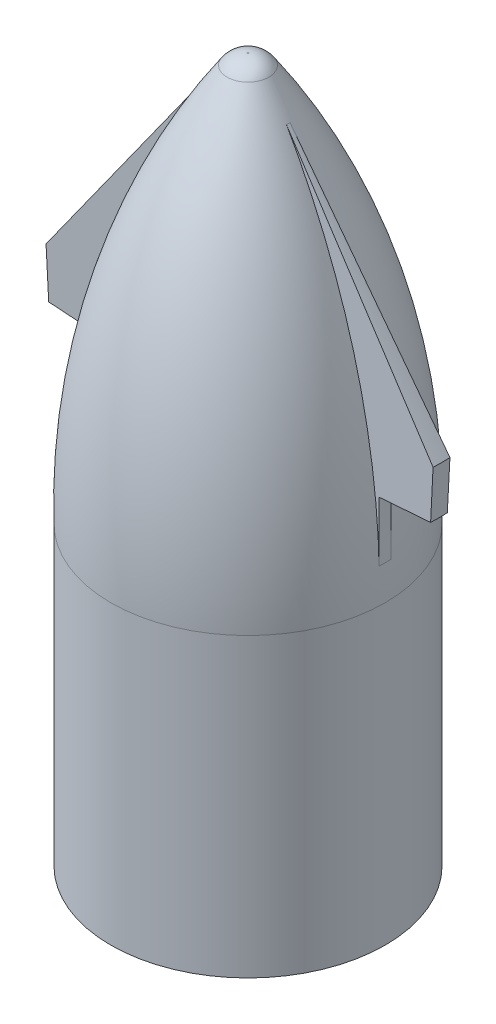
ISO-10303-21;
HEADER;
FILE_DESCRIPTION(('STEP AP214'),'2;1');
FILE_NAME('part.step','',(''),(''),'','','');
FILE_SCHEMA(('AUTOMOTIVE_DESIGN { 1 0 10303 214 1 1 1 1 }'));
ENDSEC;
DATA;
#1=APPLICATION_CONTEXT('core data for automotive mechanical design processes');
#2=APPLICATION_PROTOCOL_DEFINITION('international standard','automotive_design',2000,#1);
#3=PRODUCT_CONTEXT('',#1,'mechanical');
#4=PRODUCT('Part','Part','',(#3));
#5=PRODUCT_RELATED_PRODUCT_CATEGORY('part','',(#4));
#6=PRODUCT_DEFINITION_FORMATION('','',#4);
#7=PRODUCT_DEFINITION_CONTEXT('part definition',#1,'design');
#8=PRODUCT_DEFINITION('design','',#6,#7);
#9=PRODUCT_DEFINITION_SHAPE('','',#8);
#10=(LENGTH_UNIT() NAMED_UNIT(*) SI_UNIT(.MILLI.,.METRE.));
#11=(NAMED_UNIT(*) PLANE_ANGLE_UNIT() SI_UNIT($,.RADIAN.));
#12=(NAMED_UNIT(*) SI_UNIT($,.STERADIAN.) SOLID_ANGLE_UNIT());
#13=UNCERTAINTY_MEASURE_WITH_UNIT(LENGTH_MEASURE(1.E-05),#10,'distance_accuracy_value','');
#14=(GEOMETRIC_REPRESENTATION_CONTEXT(3) GLOBAL_UNCERTAINTY_ASSIGNED_CONTEXT((#13)) GLOBAL_UNIT_ASSIGNED_CONTEXT((#10,
#11,#12)) REPRESENTATION_CONTEXT('',''));
#15=CARTESIAN_POINT('',(0.,0.,0.));
#16=DIRECTION('',(0.,0.,1.));
#17=DIRECTION('',(1.,0.,0.));
#18=AXIS2_PLACEMENT_3D('',#15,#16,#17);
#19=CARTESIAN_POINT('',(0.,116.42951797231,0.));
#20=DIRECTION('',(0.,-1.,0.));
#21=DIRECTION('',(0.,0.,-1.));
#22=AXIS2_PLACEMENT_3D('',#19,#20,#21);
#23=DEGENERATE_TOROIDAL_SURFACE('',#22,199.017308921659,250.,.F.);
#24=CARTESIAN_POINT('',(0.,122.859035944618,0.));
#25=DIRECTION('',(0.,-1.,0.));
#26=DIRECTION('',(0.,0.,-1.));
#27=AXIS2_PLACEMENT_3D('',#24,#25,#26);
#28=CIRCLE('',#27,50.9);
#29=CARTESIAN_POINT('',(50.8515544785165,122.859035944618,-2.22022681689561));
#30=VERTEX_POINT('',#29);
#31=CARTESIAN_POINT('',(50.8515544785165,122.859035944618,2.22022681689561));
#32=VERTEX_POINT('',#31);
#33=EDGE_CURVE('E12',#30,#32,#28,.T.);
#34=ORIENTED_EDGE('',*,*,#33,.T.);
#35=CARTESIAN_POINT('',(-198.82788854219,116.42951797231,-8.68101309026059));
#36=DIRECTION('',(-0.0436193873653361,0.,0.999048221581858));
#37=DIRECTION('',(0.999048221581858,0.,0.0436193873653361));
#38=AXIS2_PLACEMENT_3D('',#35,#36,#37);
#39=CIRCLE('',#38,250.);
#40=CARTESIAN_POINT('',(14.0690415354094,247.152488104054,0.614267619254994));
#41=VERTEX_POINT('',#40);
#42=EDGE_CURVE('E100',#32,#41,#39,.T.);
#43=ORIENTED_EDGE('',*,*,#42,.T.);
#44=CARTESIAN_POINT('',(0.,247.152488104054,0.));
#45=DIRECTION('',(0.,-1.,0.));
#46=DIRECTION('',(0.,0.,-1.));
#47=AXIS2_PLACEMENT_3D('',#44,#45,#46);
#48=CIRCLE('',#47,14.0824449025423);
#49=CARTESIAN_POINT('',(14.0690415354094,247.152488104054,-0.614267619254994));
#50=VERTEX_POINT('',#49);
#51=EDGE_CURVE('E69',#50,#41,#48,.T.);
#52=ORIENTED_EDGE('',*,*,#51,.F.);
#53=CARTESIAN_POINT('',(-198.82788854219,116.42951797231,8.68101309026059));
#54=DIRECTION('',(0.0436193873653361,0.,0.999048221581858));
#55=DIRECTION('',(0.999048221581858,0.,-0.0436193873653361));
#56=AXIS2_PLACEMENT_3D('',#53,#54,#55);
#57=CIRCLE('',#56,250.);
#58=EDGE_CURVE('E102',#30,#50,#57,.T.);
#59=ORIENTED_EDGE('',*,*,#58,.F.);
#60=EDGE_LOOP('',(#34,#43,#52,#59));
#61=FACE_BOUND('',#60,.T.);
#62=ADVANCED_FACE('F54',(#61),#23,.T.);
#63=CARTESIAN_POINT('',(0.,108.994029955487,0.));
#64=DIRECTION('',(0.,-1.,0.));
#65=DIRECTION('',(0.,0.,-1.));
#66=AXIS2_PLACEMENT_3D('',#63,#64,#65);
#67=CYLINDRICAL_SURFACE('',#66,50.9);
#68=CARTESIAN_POINT('',(0.,145.,0.));
#69=DIRECTION('',(0.,-1.,0.));
#70=DIRECTION('',(0.,0.,-1.));
#71=AXIS2_PLACEMENT_3D('',#68,#69,#70);
#72=CIRCLE('',#71,50.9);
#73=CARTESIAN_POINT('',(50.8515544785165,145.,-2.22022681689561));
#74=VERTEX_POINT('',#73);
#75=CARTESIAN_POINT('',(50.8515544785165,145.,2.22022681689561));
#76=VERTEX_POINT('',#75);
#77=EDGE_CURVE('E62',#74,#76,#72,.T.);
#78=ORIENTED_EDGE('',*,*,#77,.T.);
#79=DIRECTION('',(0.,1.,0.));
#80=VECTOR('',#79,1.);
#81=CARTESIAN_POINT('',(50.8515544785165,0.,2.22022681689561));
#82=LINE('',#81,#80);
#83=EDGE_CURVE('E111',#32,#76,#82,.T.);
#84=ORIENTED_EDGE('',*,*,#83,.F.);
#85=ORIENTED_EDGE('',*,*,#33,.F.);
#86=DIRECTION('',(0.,1.,0.));
#87=VECTOR('',#86,1.);
#88=CARTESIAN_POINT('',(50.8515544785165,0.,-2.22022681689561));
#89=LINE('',#88,#87);
#90=EDGE_CURVE('E125',#30,#74,#89,.T.);
#91=ORIENTED_EDGE('',*,*,#90,.T.);
#92=EDGE_LOOP('',(#78,#84,#85,#91));
#93=FACE_BOUND('',#92,.T.);
#94=ADVANCED_FACE('F56',(#93),#67,.T.);
#95=CARTESIAN_POINT('',(0.,147.323164187297,0.));
#96=DIRECTION('',(0.,1.,0.));
#97=DIRECTION('',(0.,0.,1.));
#98=AXIS2_PLACEMENT_3D('',#95,#96,#97);
#99=CONICAL_SURFACE('',#98,70.9,1.45515635879768);
#100=CARTESIAN_POINT('',(0.,147.323164187297,0.));
#101=DIRECTION('',(0.,-1.,0.));
#102=DIRECTION('',(0.,0.,-1.));
#103=AXIS2_PLACEMENT_3D('',#100,#101,#102);
#104=CIRCLE('',#103,70.9);
#105=CARTESIAN_POINT('',(70.8325189101537,147.323164187297,-3.09261456420233));
#106=VERTEX_POINT('',#105);
#107=CARTESIAN_POINT('',(70.8325189101537,147.323164187297,3.09261456420233));
#108=VERTEX_POINT('',#107);
#109=EDGE_CURVE('E137',#106,#108,#104,.T.);
#110=ORIENTED_EDGE('',*,*,#109,.T.);
#111=DIRECTION('',(-0.992375725054273,-0.115382405723063,-0.043328059875388));
#112=VECTOR('',#111,1.);
#113=CARTESIAN_POINT('',(-15.9258994809328,137.235860781983,-0.695339788003712));
#114=LINE('',#113,#112);
#115=EDGE_CURVE('E116',#108,#76,#114,.T.);
#116=ORIENTED_EDGE('',*,*,#115,.T.);
#117=ORIENTED_EDGE('',*,*,#77,.F.);
#118=DIRECTION('',(-0.992375725054273,-0.115382405723063,0.043328059875388));
#119=VECTOR('',#118,1.);
#120=CARTESIAN_POINT('',(-15.9258994809328,137.235860781983,0.695339788003712));
#121=LINE('',#120,#119);
#122=EDGE_CURVE('E127',#106,#74,#121,.T.);
#123=ORIENTED_EDGE('',*,*,#122,.F.);
#124=EDGE_LOOP('',(#110,#116,#117,#123));
#125=FACE_BOUND('',#124,.T.);
#126=ADVANCED_FACE('F140',(#125),#99,.T.);
#127=CARTESIAN_POINT('',(0.,165.523219819238,0.));
#128=DIRECTION('',(0.,1.,0.));
#129=DIRECTION('',(0.,0.,1.));
#130=AXIS2_PLACEMENT_3D('',#127,#128,#129);
#131=CONICAL_SURFACE('',#130,71.8462965684885,0.0519473803326402);
#132=CARTESIAN_POINT('',(0.,165.523219819238,0.));
#133=DIRECTION('',(0.,-1.,0.));
#134=DIRECTION('',(0.,0.,-1.));
#135=AXIS2_PLACEMENT_3D('',#132,#133,#134);
#136=CIRCLE('',#135,71.8462965684885);
#137=CARTESIAN_POINT('',(71.7779148139912,165.523219819238,-3.13389144078572));
#138=VERTEX_POINT('',#137);
#139=CARTESIAN_POINT('',(71.7779148139912,165.523219819238,3.13389144078572));
#140=VERTEX_POINT('',#139);
#141=EDGE_CURVE('E77',#138,#140,#136,.T.);
#142=ORIENTED_EDGE('',*,*,#141,.T.);
#143=DIRECTION('',(-0.0518745997264521,-0.998651038230409,-0.00226489393705855));
#144=VECTOR('',#143,1.);
#145=CARTESIAN_POINT('',(63.0095261224123,-3.27924837576642,2.75105532272305));
#146=LINE('',#145,#144);
#147=EDGE_CURVE('E118',#140,#108,#146,.T.);
#148=ORIENTED_EDGE('',*,*,#147,.T.);
#149=ORIENTED_EDGE('',*,*,#109,.F.);
#150=DIRECTION('',(-0.0518745997264521,-0.998651038230409,0.00226489393705855));
#151=VECTOR('',#150,1.);
#152=CARTESIAN_POINT('',(63.0095261224123,-3.27924837576642,-2.75105532272305));
#153=LINE('',#152,#151);
#154=EDGE_CURVE('E130',#138,#106,#153,.T.);
#155=ORIENTED_EDGE('',*,*,#154,.F.);
#156=EDGE_LOOP('',(#142,#148,#149,#155));
#157=FACE_BOUND('',#156,.T.);
#158=ADVANCED_FACE('F142',(#157),#131,.T.);
#159=CARTESIAN_POINT('',(0.,165.523219819238,0.));
#160=DIRECTION('',(0.,-1.,0.));
#161=DIRECTION('',(0.,0.,-1.));
#162=AXIS2_PLACEMENT_3D('',#159,#160,#161);
#163=CONICAL_SURFACE('',#162,71.8462965684885,0.615832782362428);
#164=DIRECTION('',(-0.577088732785819,0.816292682848165,0.0251962382153073));
#165=VECTOR('',#164,1.);
#166=CARTESIAN_POINT('',(125.801617749702,89.1066292649552,-5.4926172503682));
#167=LINE('',#166,#165);
#168=EDGE_CURVE('E133',#138,#50,#167,.T.);
#169=ORIENTED_EDGE('',*,*,#168,.T.);
#170=ORIENTED_EDGE('',*,*,#51,.T.);
#171=DIRECTION('',(-0.577088732785819,0.816292682848165,-0.0251962382153073));
#172=VECTOR('',#171,1.);
#173=CARTESIAN_POINT('',(125.801617749702,89.1066292649552,5.4926172503682));
#174=LINE('',#173,#172);
#175=EDGE_CURVE('E114',#140,#41,#174,.T.);
#176=ORIENTED_EDGE('',*,*,#175,.F.);
#177=ORIENTED_EDGE('',*,*,#141,.F.);
#178=EDGE_LOOP('',(#169,#170,#176,#177));
#179=FACE_BOUND('',#178,.T.);
#180=ADVANCED_FACE('F146',(#179),#163,.T.);
#181=CARTESIAN_POINT('',(0.,0.,0.));
#182=DIRECTION('',(0.0436193873653361,0.,0.999048221581858));
#183=DIRECTION('',(0.999048221581858,0.,-0.0436193873653361));
#184=AXIS2_PLACEMENT_3D('',#181,#182,#183);
#185=PLANE('',#184);
#186=ORIENTED_EDGE('',*,*,#58,.T.);
#187=ORIENTED_EDGE('',*,*,#168,.F.);
#188=ORIENTED_EDGE('',*,*,#154,.T.);
#189=ORIENTED_EDGE('',*,*,#122,.T.);
#190=ORIENTED_EDGE('',*,*,#90,.F.);
#191=EDGE_LOOP('',(#186,#187,#188,#189,#190));
#192=FACE_BOUND('',#191,.T.);
#193=ADVANCED_FACE('F145',(#192),#185,.F.);
#194=CARTESIAN_POINT('',(0.,0.,0.));
#195=DIRECTION('',(-0.0436193873653361,0.,0.999048221581858));
#196=DIRECTION('',(0.999048221581858,0.,0.0436193873653361));
#197=AXIS2_PLACEMENT_3D('',#194,#195,#196);
#198=PLANE('',#197);
#199=ORIENTED_EDGE('',*,*,#42,.F.);
#200=ORIENTED_EDGE('',*,*,#83,.T.);
#201=ORIENTED_EDGE('',*,*,#115,.F.);
#202=ORIENTED_EDGE('',*,*,#147,.F.);
#203=ORIENTED_EDGE('',*,*,#175,.T.);
#204=EDGE_LOOP('',(#199,#200,#201,#202,#203));
#205=FACE_BOUND('',#204,.T.);
#206=ADVANCED_FACE('F109',(#205),#198,.T.);
#207=CLOSED_SHELL('',(#62,#94,#126,#158,#180,#193,#206));
#208=MANIFOLD_SOLID_BREP('B2',#207);
#209=CARTESIAN_POINT('',(0.,108.994029955487,0.));
#210=DIRECTION('',(0.,-1.,0.));
#211=DIRECTION('',(0.,0.,-1.));
#212=AXIS2_PLACEMENT_3D('',#209,#210,#211);
#213=CYLINDRICAL_SURFACE('',#212,50.9);
#214=CARTESIAN_POINT('',(0.,122.859035944618,0.));
#215=DIRECTION('',(0.,-1.,0.));
#216=DIRECTION('',(0.,0.,-1.));
#217=AXIS2_PLACEMENT_3D('',#214,#215,#216);
#218=CIRCLE('',#217,50.9);
#219=CARTESIAN_POINT('',(-50.8515544785165,122.859035944618,2.22022681689561));
#220=VERTEX_POINT('',#219);
#221=CARTESIAN_POINT('',(-50.8515544785165,122.859035944618,-2.22022681689561));
#222=VERTEX_POINT('',#221);
#223=EDGE_CURVE('E52',#220,#222,#218,.T.);
#224=ORIENTED_EDGE('',*,*,#223,.F.);
#225=DIRECTION('',(0.,1.,0.));
#226=VECTOR('',#225,1.);
#227=CARTESIAN_POINT('',(-50.8515544785165,0.,2.22022681689561));
#228=LINE('',#227,#226);
#229=CARTESIAN_POINT('',(-50.8515544785165,145.,2.22022681689561));
#230=VERTEX_POINT('',#229);
#231=EDGE_CURVE('E283',#220,#230,#228,.T.);
#232=ORIENTED_EDGE('',*,*,#231,.T.);
#233=CARTESIAN_POINT('',(0.,145.,0.));
#234=DIRECTION('',(0.,-1.,0.));
#235=DIRECTION('',(0.,0.,-1.));
#236=AXIS2_PLACEMENT_3D('',#233,#234,#235);
#237=CIRCLE('',#236,50.9);
#238=CARTESIAN_POINT('',(-50.8515544785165,145.,-2.22022681689561));
#239=VERTEX_POINT('',#238);
#240=EDGE_CURVE('E226',#230,#239,#237,.T.);
#241=ORIENTED_EDGE('',*,*,#240,.T.);
#242=DIRECTION('',(0.,1.,0.));
#243=VECTOR('',#242,1.);
#244=CARTESIAN_POINT('',(-50.8515544785165,0.,-2.22022681689561));
#245=LINE('',#244,#243);
#246=EDGE_CURVE('E268',#222,#239,#245,.T.);
#247=ORIENTED_EDGE('',*,*,#246,.F.);
#248=EDGE_LOOP('',(#224,#232,#241,#247));
#249=FACE_BOUND('',#248,.T.);
#250=ADVANCED_FACE('F211',(#249),#213,.T.);
#251=CARTESIAN_POINT('',(0.,116.42951797231,0.));
#252=DIRECTION('',(0.,-1.,0.));
#253=DIRECTION('',(0.,0.,-1.));
#254=AXIS2_PLACEMENT_3D('',#251,#252,#253);
#255=DEGENERATE_TOROIDAL_SURFACE('',#254,199.017308921659,250.,.F.);
#256=CARTESIAN_POINT('',(0.,247.152488104054,0.));
#257=DIRECTION('',(0.,-1.,0.));
#258=DIRECTION('',(0.,0.,-1.));
#259=AXIS2_PLACEMENT_3D('',#256,#257,#258);
#260=CIRCLE('',#259,14.0824449025423);
#261=CARTESIAN_POINT('',(-14.0690415354093,247.152488104054,0.614267619254993));
#262=VERTEX_POINT('',#261);
#263=CARTESIAN_POINT('',(-14.0690415354093,247.152488104054,-0.614267619254993));
#264=VERTEX_POINT('',#263);
#265=EDGE_CURVE('E219',#262,#264,#260,.T.);
#266=ORIENTED_EDGE('',*,*,#265,.F.);
#267=CARTESIAN_POINT('',(198.82788854219,116.42951797231,-8.68101309026059));
#268=DIRECTION('',(0.0436193873653361,0.,0.999048221581858));
#269=DIRECTION('',(0.999048221581858,0.,-0.0436193873653361));
#270=AXIS2_PLACEMENT_3D('',#267,#268,#269);
#271=CIRCLE('',#270,250.);
#272=EDGE_CURVE('E264',#220,#262,#271,.F.);
#273=ORIENTED_EDGE('',*,*,#272,.F.);
#274=ORIENTED_EDGE('',*,*,#223,.T.);
#275=CARTESIAN_POINT('',(198.82788854219,116.42951797231,8.68101309026059));
#276=DIRECTION('',(-0.0436193873653361,0.,0.999048221581858));
#277=DIRECTION('',(0.999048221581858,0.,0.0436193873653361));
#278=AXIS2_PLACEMENT_3D('',#275,#276,#277);
#279=CIRCLE('',#278,250.);
#280=EDGE_CURVE('E261',#222,#264,#279,.F.);
#281=ORIENTED_EDGE('',*,*,#280,.T.);
#282=EDGE_LOOP('',(#266,#273,#274,#281));
#283=FACE_BOUND('',#282,.T.);
#284=ADVANCED_FACE('F213',(#283),#255,.T.);
#285=CARTESIAN_POINT('',(0.,165.523219819238,0.));
#286=DIRECTION('',(0.,-1.,0.));
#287=DIRECTION('',(0.,0.,-1.));
#288=AXIS2_PLACEMENT_3D('',#285,#286,#287);
#289=CONICAL_SURFACE('',#288,71.8462965684885,0.615832782362427);
#290=CARTESIAN_POINT('',(0.,165.523219819238,0.));
#291=DIRECTION('',(0.,-1.,0.));
#292=DIRECTION('',(0.,0.,-1.));
#293=AXIS2_PLACEMENT_3D('',#290,#291,#292);
#294=CIRCLE('',#293,71.8462965684885);
#295=CARTESIAN_POINT('',(-71.7779148139912,165.523219819238,3.13389144078572));
#296=VERTEX_POINT('',#295);
#297=CARTESIAN_POINT('',(-71.7779148139912,165.523219819238,-3.13389144078572));
#298=VERTEX_POINT('',#297);
#299=EDGE_CURVE('E296',#296,#298,#294,.T.);
#300=ORIENTED_EDGE('',*,*,#299,.F.);
#301=DIRECTION('',(0.577088732785818,0.816292682848166,-0.0251962382153072));
#302=VECTOR('',#301,1.);
#303=CARTESIAN_POINT('',(-125.801617749702,89.1066292649551,5.4926172503682));
#304=LINE('',#303,#302);
#305=EDGE_CURVE('E286',#296,#262,#304,.T.);
#306=ORIENTED_EDGE('',*,*,#305,.T.);
#307=ORIENTED_EDGE('',*,*,#265,.T.);
#308=DIRECTION('',(0.577088732785818,0.816292682848166,0.0251962382153072));
#309=VECTOR('',#308,1.);
#310=CARTESIAN_POINT('',(-125.801617749702,89.1066292649551,-5.4926172503682));
#311=LINE('',#310,#309);
#312=EDGE_CURVE('E275',#298,#264,#311,.T.);
#313=ORIENTED_EDGE('',*,*,#312,.F.);
#314=EDGE_LOOP('',(#300,#306,#307,#313));
#315=FACE_BOUND('',#314,.T.);
#316=ADVANCED_FACE('F298',(#315),#289,.T.);
#317=CARTESIAN_POINT('',(0.,165.523219819238,0.));
#318=DIRECTION('',(0.,1.,0.));
#319=DIRECTION('',(0.,0.,1.));
#320=AXIS2_PLACEMENT_3D('',#317,#318,#319);
#321=CONICAL_SURFACE('',#320,71.8462965684885,0.051947380332641);
#322=CARTESIAN_POINT('',(0.,147.323164187297,0.));
#323=DIRECTION('',(0.,-1.,0.));
#324=DIRECTION('',(0.,0.,-1.));
#325=AXIS2_PLACEMENT_3D('',#322,#323,#324);
#326=CIRCLE('',#325,70.9);
#327=CARTESIAN_POINT('',(-70.8325189101537,147.323164187297,3.09261456420233));
#328=VERTEX_POINT('',#327);
#329=CARTESIAN_POINT('',(-70.8325189101537,147.323164187297,-3.09261456420233));
#330=VERTEX_POINT('',#329);
#331=EDGE_CURVE('E234',#328,#330,#326,.T.);
#332=ORIENTED_EDGE('',*,*,#331,.F.);
#333=DIRECTION('',(0.0518745997264521,-0.998651038230409,-0.00226489393705855));
#334=VECTOR('',#333,1.);
#335=CARTESIAN_POINT('',(-63.0095261224123,-3.27924837576642,2.75105532272305));
#336=LINE('',#335,#334);
#337=EDGE_CURVE('E289',#296,#328,#336,.T.);
#338=ORIENTED_EDGE('',*,*,#337,.F.);
#339=ORIENTED_EDGE('',*,*,#299,.T.);
#340=DIRECTION('',(0.0518745997264521,-0.998651038230409,0.00226489393705855));
#341=VECTOR('',#340,1.);
#342=CARTESIAN_POINT('',(-63.0095261224123,-3.27924837576642,-2.75105532272305));
#343=LINE('',#342,#341);
#344=EDGE_CURVE('E277',#298,#330,#343,.T.);
#345=ORIENTED_EDGE('',*,*,#344,.T.);
#346=EDGE_LOOP('',(#332,#338,#339,#345));
#347=FACE_BOUND('',#346,.T.);
#348=ADVANCED_FACE('F303',(#347),#321,.T.);
#349=CARTESIAN_POINT('',(0.,147.323164187297,0.));
#350=DIRECTION('',(0.,1.,0.));
#351=DIRECTION('',(0.,0.,1.));
#352=AXIS2_PLACEMENT_3D('',#349,#350,#351);
#353=CONICAL_SURFACE('',#352,70.9,1.45515635879768);
#354=DIRECTION('',(0.992375725054273,-0.115382405723063,-0.043328059875388));
#355=VECTOR('',#354,1.);
#356=CARTESIAN_POINT('',(15.9258994809328,137.235860781983,-0.695339788003712));
#357=LINE('',#356,#355);
#358=EDGE_CURVE('E291',#328,#230,#357,.T.);
#359=ORIENTED_EDGE('',*,*,#358,.F.);
#360=ORIENTED_EDGE('',*,*,#331,.T.);
#361=DIRECTION('',(0.992375725054273,-0.115382405723063,0.043328059875388));
#362=VECTOR('',#361,1.);
#363=CARTESIAN_POINT('',(15.9258994809328,137.235860781983,0.695339788003712));
#364=LINE('',#363,#362);
#365=EDGE_CURVE('E281',#330,#239,#364,.T.);
#366=ORIENTED_EDGE('',*,*,#365,.T.);
#367=ORIENTED_EDGE('',*,*,#240,.F.);
#368=EDGE_LOOP('',(#359,#360,#366,#367));
#369=FACE_BOUND('',#368,.T.);
#370=ADVANCED_FACE('F302',(#369),#353,.T.);
#371=CARTESIAN_POINT('',(0.,0.,0.));
#372=DIRECTION('',(0.0436193873653361,0.,0.999048221581858));
#373=DIRECTION('',(0.999048221581858,0.,-0.0436193873653361));
#374=AXIS2_PLACEMENT_3D('',#371,#372,#373);
#375=PLANE('',#374);
#376=ORIENTED_EDGE('',*,*,#231,.F.);
#377=ORIENTED_EDGE('',*,*,#272,.T.);
#378=ORIENTED_EDGE('',*,*,#305,.F.);
#379=ORIENTED_EDGE('',*,*,#337,.T.);
#380=ORIENTED_EDGE('',*,*,#358,.T.);
#381=EDGE_LOOP('',(#376,#377,#378,#379,#380));
#382=FACE_BOUND('',#381,.T.);
#383=ADVANCED_FACE('F301',(#382),#375,.T.);
#384=CARTESIAN_POINT('',(0.,0.,0.));
#385=DIRECTION('',(-0.0436193873653361,0.,0.999048221581858));
#386=DIRECTION('',(0.999048221581858,0.,0.0436193873653361));
#387=AXIS2_PLACEMENT_3D('',#384,#385,#386);
#388=PLANE('',#387);
#389=ORIENTED_EDGE('',*,*,#246,.T.);
#390=ORIENTED_EDGE('',*,*,#365,.F.);
#391=ORIENTED_EDGE('',*,*,#344,.F.);
#392=ORIENTED_EDGE('',*,*,#312,.T.);
#393=ORIENTED_EDGE('',*,*,#280,.F.);
#394=EDGE_LOOP('',(#389,#390,#391,#392,#393));
#395=FACE_BOUND('',#394,.T.);
#396=ADVANCED_FACE('F272',(#395),#388,.F.);
#397=CLOSED_SHELL('',(#250,#284,#316,#348,#370,#383,#396));
#398=MANIFOLD_SOLID_BREP('B6',#397);
#399=CARTESIAN_POINT('',(0.,261.192559340729,0.));
#400=DIRECTION('',(0.,-1.,0.));
#401=DIRECTION('',(0.,0.,-1.));
#402=AXIS2_PLACEMENT_3D('',#399,#400,#401);
#403=PLANE('',#402);
#404=CARTESIAN_POINT('',(0.,261.192559340729,0.));
#405=DIRECTION('',(0.,1.,0.));
#406=DIRECTION('',(0.,0.,1.));
#407=AXIS2_PLACEMENT_3D('',#404,#405,#406);
#408=CIRCLE('',#407,0.291414436216326);
#409=CARTESIAN_POINT('',(0.,261.192559340729,0.291414436216326));
#410=VERTEX_POINT('',#409);
#411=EDGE_CURVE('E383',#410,#410,#408,.T.);
#412=ORIENTED_EDGE('',*,*,#411,.T.);
#413=EDGE_LOOP('',(#412));
#414=FACE_BOUND('',#413,.T.);
#415=ADVANCED_FACE('F362',(#414),#403,.F.);
#416=CARTESIAN_POINT('',(0.,252.192559340729,0.));
#417=DIRECTION('',(0.,1.,0.));
#418=DIRECTION('',(0.,0.,1.));
#419=AXIS2_PLACEMENT_3D('',#416,#417,#418);
#420=DEGENERATE_TOROIDAL_SURFACE('',#419,0.291414436216326,9.00000000000003,.T.);
#421=ORIENTED_EDGE('',*,*,#411,.F.);
#422=EDGE_LOOP('',(#421));
#423=FACE_BOUND('',#422,.T.);
#424=CARTESIAN_POINT('',(0.,257.25266372832,0.));
#425=DIRECTION('',(0.,1.,0.));
#426=DIRECTION('',(0.,0.,1.));
#427=AXIS2_PLACEMENT_3D('',#424,#425,#426);
#428=CIRCLE('',#427,7.73421925608714);
#429=CARTESIAN_POINT('',(0.,257.25266372832,7.73421925608714));
#430=VERTEX_POINT('',#429);
#431=EDGE_CURVE('E386',#430,#430,#428,.T.);
#432=ORIENTED_EDGE('',*,*,#431,.T.);
#433=EDGE_LOOP('',(#432));
#434=FACE_BOUND('',#433,.T.);
#435=ADVANCED_FACE('F409',(#423,#434),#420,.T.);
#436=CARTESIAN_POINT('',(0.,116.694208517485,0.));
#437=DIRECTION('',(0.,1.,0.));
#438=DIRECTION('',(0.,0.,1.));
#439=AXIS2_PLACEMENT_3D('',#436,#437,#438);
#440=DEGENERATE_TOROIDAL_SURFACE('',#439,199.010359073658,250.,.F.);
#441=ORIENTED_EDGE('',*,*,#431,.F.);
#442=EDGE_LOOP('',(#441));
#443=FACE_BOUND('',#442,.T.);
#444=CARTESIAN_POINT('',(0.,110.,0.));
#445=DIRECTION('',(0.,1.,0.));
#446=DIRECTION('',(0.,0.,1.));
#447=AXIS2_PLACEMENT_3D('',#444,#445,#446);
#448=CIRCLE('',#447,50.9);
#449=CARTESIAN_POINT('',(0.,110.,50.9));
#450=VERTEX_POINT('',#449);
#451=EDGE_CURVE('E389',#450,#450,#448,.T.);
#452=ORIENTED_EDGE('',*,*,#451,.T.);
#453=EDGE_LOOP('',(#452));
#454=FACE_BOUND('',#453,.T.);
#455=ADVANCED_FACE('F405',(#443,#454),#440,.F.);
#456=CARTESIAN_POINT('',(0.,261.192559340729,0.));
#457=DIRECTION('',(0.,1.,0.));
#458=DIRECTION('',(0.,0.,1.));
#459=AXIS2_PLACEMENT_3D('',#456,#457,#458);
#460=CYLINDRICAL_SURFACE('',#459,50.9);
#461=ORIENTED_EDGE('',*,*,#451,.F.);
#462=EDGE_LOOP('',(#461));
#463=FACE_BOUND('',#462,.T.);
#464=CARTESIAN_POINT('',(0.,0.,0.));
#465=DIRECTION('',(0.,1.,0.));
#466=DIRECTION('',(0.,0.,1.));
#467=AXIS2_PLACEMENT_3D('',#464,#465,#466);
#468=CIRCLE('',#467,50.9);
#469=CARTESIAN_POINT('',(0.,0.,50.9));
#470=VERTEX_POINT('',#469);
#471=EDGE_CURVE('E392',#470,#470,#468,.T.);
#472=ORIENTED_EDGE('',*,*,#471,.T.);
#473=EDGE_LOOP('',(#472));
#474=FACE_BOUND('',#473,.T.);
#475=ADVANCED_FACE('F396',(#463,#474),#460,.T.);
#476=CARTESIAN_POINT('',(0.,0.,0.));
#477=DIRECTION('',(0.,1.,0.));
#478=DIRECTION('',(0.,0.,1.));
#479=AXIS2_PLACEMENT_3D('',#476,#477,#478);
#480=PLANE('',#479);
#481=ORIENTED_EDGE('',*,*,#471,.F.);
#482=EDGE_LOOP('',(#481));
#483=FACE_BOUND('',#482,.T.);
#484=ADVANCED_FACE('F398',(#483),#480,.F.);
#485=CLOSED_SHELL('',(#415,#435,#455,#475,#484));
#486=CARTESIAN_POINT('',(0.,3.,0.));
#487=DIRECTION('',(0.,-1.,0.));
#488=DIRECTION('',(0.,0.,-1.));
#489=AXIS2_PLACEMENT_3D('',#486,#487,#488);
#490=PLANE('',#489);
#491=CARTESIAN_POINT('',(0.,3.,0.));
#492=DIRECTION('',(0.,1.,0.));
#493=DIRECTION('',(0.,0.,1.));
#494=AXIS2_PLACEMENT_3D('',#491,#492,#493);
#495=CIRCLE('',#494,47.9);
#496=CARTESIAN_POINT('',(0.,3.,47.9));
#497=VERTEX_POINT('',#496);
#498=EDGE_CURVE('E210',#497,#497,#495,.T.);
#499=ORIENTED_EDGE('',*,*,#498,.T.);
#500=EDGE_LOOP('',(#499));
#501=FACE_BOUND('',#500,.T.);
#502=ADVANCED_FACE('F364',(#501),#490,.F.);
#503=CARTESIAN_POINT('',(0.,261.192559340729,0.));
#504=DIRECTION('',(0.,1.,0.));
#505=DIRECTION('',(0.,0.,1.));
#506=AXIS2_PLACEMENT_3D('',#503,#504,#505);
#507=CYLINDRICAL_SURFACE('',#506,47.9);
#508=ORIENTED_EDGE('',*,*,#498,.F.);
#509=EDGE_LOOP('',(#508));
#510=FACE_BOUND('',#509,.T.);
#511=CARTESIAN_POINT('',(0.,110.040293721104,0.));
#512=DIRECTION('',(0.,1.,0.));
#513=DIRECTION('',(0.,0.,1.));
#514=AXIS2_PLACEMENT_3D('',#511,#512,#513);
#515=CIRCLE('',#514,47.9);
#516=CARTESIAN_POINT('',(0.,110.040293721104,47.9));
#517=VERTEX_POINT('',#516);
#518=EDGE_CURVE('E370',#517,#517,#515,.T.);
#519=ORIENTED_EDGE('',*,*,#518,.T.);
#520=EDGE_LOOP('',(#519));
#521=FACE_BOUND('',#520,.T.);
#522=ADVANCED_FACE('F430',(#510,#521),#507,.F.);
#523=CARTESIAN_POINT('',(0.,116.694208517485,0.));
#524=DIRECTION('',(0.,1.,0.));
#525=DIRECTION('',(0.,0.,1.));
#526=AXIS2_PLACEMENT_3D('',#523,#524,#525);
#527=DEGENERATE_TOROIDAL_SURFACE('',#526,199.010359073658,247.,.F.);
#528=ORIENTED_EDGE('',*,*,#518,.F.);
#529=EDGE_LOOP('',(#528));
#530=FACE_BOUND('',#529,.T.);
#531=CARTESIAN_POINT('',(0.,255.56596226579,0.));
#532=DIRECTION('',(0.,1.,0.));
#533=DIRECTION('',(0.,0.,1.));
#534=AXIS2_PLACEMENT_3D('',#531,#532,#533);
#535=CIRCLE('',#534,5.25328431613018);
#536=CARTESIAN_POINT('',(0.,255.56596226579,5.25328431613018));
#537=VERTEX_POINT('',#536);
#538=EDGE_CURVE('E374',#537,#537,#535,.T.);
#539=ORIENTED_EDGE('',*,*,#538,.T.);
#540=EDGE_LOOP('',(#539));
#541=FACE_BOUND('',#540,.T.);
#542=ADVANCED_FACE('F427',(#530,#541),#527,.T.);
#543=CARTESIAN_POINT('',(0.,252.192559340729,0.));
#544=DIRECTION('',(0.,1.,0.));
#545=DIRECTION('',(0.,0.,1.));
#546=AXIS2_PLACEMENT_3D('',#543,#544,#545);
#547=DEGENERATE_TOROIDAL_SURFACE('',#546,0.291414436216326,6.,.T.);
#548=ORIENTED_EDGE('',*,*,#538,.F.);
#549=EDGE_LOOP('',(#548));
#550=FACE_BOUND('',#549,.T.);
#551=CARTESIAN_POINT('',(0.,258.192559340729,0.));
#552=DIRECTION('',(0.,1.,0.));
#553=DIRECTION('',(0.,0.,1.));
#554=AXIS2_PLACEMENT_3D('',#551,#552,#553);
#555=CIRCLE('',#554,0.291414436216327);
#556=CARTESIAN_POINT('',(0.,258.192559340729,0.291414436216327));
#557=VERTEX_POINT('',#556);
#558=EDGE_CURVE('E378',#557,#557,#555,.T.);
#559=ORIENTED_EDGE('',*,*,#558,.T.);
#560=EDGE_LOOP('',(#559));
#561=FACE_BOUND('',#560,.T.);
#562=ADVANCED_FACE('F422',(#550,#561),#547,.F.);
#563=CARTESIAN_POINT('',(0.,258.192559340729,0.));
#564=DIRECTION('',(0.,1.,0.));
#565=DIRECTION('',(0.,0.,1.));
#566=AXIS2_PLACEMENT_3D('',#563,#564,#565);
#567=PLANE('',#566);
#568=ORIENTED_EDGE('',*,*,#558,.F.);
#569=EDGE_LOOP('',(#568));
#570=FACE_BOUND('',#569,.T.);
#571=ADVANCED_FACE('F419',(#570),#567,.F.);
#572=CLOSED_SHELL('',(#502,#522,#542,#562,#571));
#573=ORIENTED_CLOSED_SHELL('',*,#572,.T.);
#574=BREP_WITH_VOIDS('B46',#485,(#573));
#575=ADVANCED_BREP_SHAPE_REPRESENTATION('',(#18,#208,#398,#574),#14);
#576=SHAPE_DEFINITION_REPRESENTATION(#9,#575);
ENDSEC;
END-ISO-10303-21;
